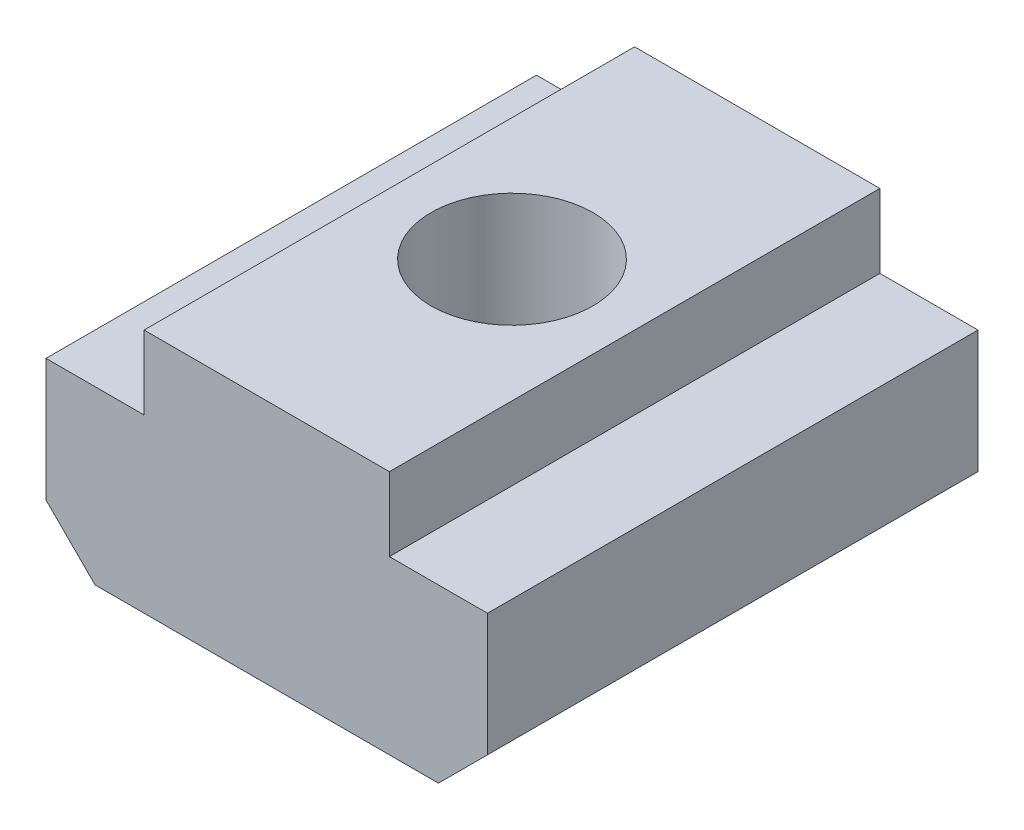
ISO-10303-21;
HEADER;
FILE_DESCRIPTION(('STEP AP214'),'2;1');
FILE_NAME('part.step','',(''),(''),'','','');
FILE_SCHEMA(('AUTOMOTIVE_DESIGN { 1 0 10303 214 1 1 1 1 }'));
ENDSEC;
DATA;
#1=APPLICATION_CONTEXT('core data for automotive mechanical design processes');
#2=APPLICATION_PROTOCOL_DEFINITION('international standard','automotive_design',2000,#1);
#3=PRODUCT_CONTEXT('',#1,'mechanical');
#4=PRODUCT('Part','Part','',(#3));
#5=PRODUCT_RELATED_PRODUCT_CATEGORY('part','',(#4));
#6=PRODUCT_DEFINITION_FORMATION('','',#4);
#7=PRODUCT_DEFINITION_CONTEXT('part definition',#1,'design');
#8=PRODUCT_DEFINITION('design','',#6,#7);
#9=PRODUCT_DEFINITION_SHAPE('','',#8);
#10=(LENGTH_UNIT() NAMED_UNIT(*) SI_UNIT(.MILLI.,.METRE.));
#11=(NAMED_UNIT(*) PLANE_ANGLE_UNIT() SI_UNIT($,.RADIAN.));
#12=(NAMED_UNIT(*) SI_UNIT($,.STERADIAN.) SOLID_ANGLE_UNIT());
#13=UNCERTAINTY_MEASURE_WITH_UNIT(LENGTH_MEASURE(1.E-05),#10,'distance_accuracy_value','');
#14=(GEOMETRIC_REPRESENTATION_CONTEXT(3) GLOBAL_UNCERTAINTY_ASSIGNED_CONTEXT((#13)) GLOBAL_UNIT_ASSIGNED_CONTEXT((#10,
#11,#12)) REPRESENTATION_CONTEXT('',''));
#15=CARTESIAN_POINT('',(0.,0.,0.));
#16=DIRECTION('',(0.,0.,1.));
#17=DIRECTION('',(1.,0.,0.));
#18=AXIS2_PLACEMENT_3D('',#15,#16,#17);
#19=CARTESIAN_POINT('',(-4.5,1.,10.));
#20=DIRECTION('',(0.707106781186547,0.707106781186548,0.));
#21=DIRECTION('',(-0.707106781186548,0.707106781186547,0.));
#22=AXIS2_PLACEMENT_3D('',#19,#20,#21);
#23=PLANE('',#22);
#24=DIRECTION('',(0.707106781186548,-0.707106781186547,0.));
#25=VECTOR('',#24,1.);
#26=CARTESIAN_POINT('',(-4.5,1.,0.));
#27=LINE('',#26,#25);
#28=CARTESIAN_POINT('',(-4.5,1.,0.));
#29=VERTEX_POINT('',#28);
#30=CARTESIAN_POINT('',(-3.5,0.,0.));
#31=VERTEX_POINT('',#30);
#32=EDGE_CURVE('E145',#29,#31,#27,.T.);
#33=ORIENTED_EDGE('',*,*,#32,.T.);
#34=DIRECTION('',(0.,0.,-1.));
#35=VECTOR('',#34,1.);
#36=CARTESIAN_POINT('',(-3.5,0.,10.));
#37=LINE('',#36,#35);
#38=CARTESIAN_POINT('',(-3.5,0.,10.));
#39=VERTEX_POINT('',#38);
#40=EDGE_CURVE('E11',#39,#31,#37,.T.);
#41=ORIENTED_EDGE('',*,*,#40,.F.);
#42=DIRECTION('',(0.707106781186548,-0.707106781186547,0.));
#43=VECTOR('',#42,1.);
#44=CARTESIAN_POINT('',(-4.5,1.,10.));
#45=LINE('',#44,#43);
#46=CARTESIAN_POINT('',(-4.5,1.,10.));
#47=VERTEX_POINT('',#46);
#48=EDGE_CURVE('E164',#47,#39,#45,.T.);
#49=ORIENTED_EDGE('',*,*,#48,.F.);
#50=DIRECTION('',(0.,0.,-1.));
#51=VECTOR('',#50,1.);
#52=CARTESIAN_POINT('',(-4.5,1.,10.));
#53=LINE('',#52,#51);
#54=EDGE_CURVE('E141',#47,#29,#53,.T.);
#55=ORIENTED_EDGE('',*,*,#54,.T.);
#56=EDGE_LOOP('',(#33,#41,#49,#55));
#57=FACE_BOUND('',#56,.T.);
#58=ADVANCED_FACE('F37',(#57),#23,.F.);
#59=CARTESIAN_POINT('',(-3.5,0.,10.));
#60=DIRECTION('',(0.,1.,0.));
#61=DIRECTION('',(0.,0.,1.));
#62=AXIS2_PLACEMENT_3D('',#59,#60,#61);
#63=PLANE('',#62);
#64=CARTESIAN_POINT('',(0.,0.,5.));
#65=DIRECTION('',(0.,1.,0.));
#66=DIRECTION('',(0.,0.,1.));
#67=AXIS2_PLACEMENT_3D('',#64,#65,#66);
#68=CIRCLE('',#67,1.65);
#69=CARTESIAN_POINT('',(0.,0.,6.65));
#70=VERTEX_POINT('',#69);
#71=EDGE_CURVE('E149',#70,#70,#68,.T.);
#72=ORIENTED_EDGE('',*,*,#71,.T.);
#73=EDGE_LOOP('',(#72));
#74=FACE_BOUND('',#73,.T.);
#75=DIRECTION('',(1.,0.,0.));
#76=VECTOR('',#75,1.);
#77=CARTESIAN_POINT('',(-3.5,0.,0.));
#78=LINE('',#77,#76);
#79=CARTESIAN_POINT('',(3.5,0.,0.));
#80=VERTEX_POINT('',#79);
#81=EDGE_CURVE('E148',#31,#80,#78,.T.);
#82=ORIENTED_EDGE('',*,*,#81,.T.);
#83=DIRECTION('',(0.,0.,-1.));
#84=VECTOR('',#83,1.);
#85=CARTESIAN_POINT('',(3.5,0.,10.));
#86=LINE('',#85,#84);
#87=CARTESIAN_POINT('',(3.5,0.,10.));
#88=VERTEX_POINT('',#87);
#89=EDGE_CURVE('E45',#88,#80,#86,.T.);
#90=ORIENTED_EDGE('',*,*,#89,.F.);
#91=DIRECTION('',(1.,0.,0.));
#92=VECTOR('',#91,1.);
#93=CARTESIAN_POINT('',(-3.5,0.,10.));
#94=LINE('',#93,#92);
#95=EDGE_CURVE('E102',#39,#88,#94,.T.);
#96=ORIENTED_EDGE('',*,*,#95,.F.);
#97=ORIENTED_EDGE('',*,*,#40,.T.);
#98=EDGE_LOOP('',(#82,#90,#96,#97));
#99=FACE_BOUND('',#98,.T.);
#100=ADVANCED_FACE('F240',(#74,#99),#63,.F.);
#101=CARTESIAN_POINT('',(3.5,0.,10.));
#102=DIRECTION('',(-0.707106781186547,0.707106781186548,0.));
#103=DIRECTION('',(-0.707106781186548,-0.707106781186547,0.));
#104=AXIS2_PLACEMENT_3D('',#101,#102,#103);
#105=PLANE('',#104);
#106=DIRECTION('',(0.707106781186548,0.707106781186547,0.));
#107=VECTOR('',#106,1.);
#108=CARTESIAN_POINT('',(3.5,0.,0.));
#109=LINE('',#108,#107);
#110=CARTESIAN_POINT('',(4.5,1.,0.));
#111=VERTEX_POINT('',#110);
#112=EDGE_CURVE('E151',#80,#111,#109,.T.);
#113=ORIENTED_EDGE('',*,*,#112,.T.);
#114=DIRECTION('',(0.,0.,-1.));
#115=VECTOR('',#114,1.);
#116=CARTESIAN_POINT('',(4.5,1.,10.));
#117=LINE('',#116,#115);
#118=CARTESIAN_POINT('',(4.5,1.,10.));
#119=VERTEX_POINT('',#118);
#120=EDGE_CURVE('E177',#119,#111,#117,.T.);
#121=ORIENTED_EDGE('',*,*,#120,.F.);
#122=DIRECTION('',(0.707106781186548,0.707106781186547,0.));
#123=VECTOR('',#122,1.);
#124=CARTESIAN_POINT('',(3.5,0.,10.));
#125=LINE('',#124,#123);
#126=EDGE_CURVE('E185',#88,#119,#125,.T.);
#127=ORIENTED_EDGE('',*,*,#126,.F.);
#128=ORIENTED_EDGE('',*,*,#89,.T.);
#129=EDGE_LOOP('',(#113,#121,#127,#128));
#130=FACE_BOUND('',#129,.T.);
#131=ADVANCED_FACE('F183',(#130),#105,.F.);
#132=CARTESIAN_POINT('',(4.5,1.,10.));
#133=DIRECTION('',(-1.,0.,0.));
#134=DIRECTION('',(0.,0.,1.));
#135=AXIS2_PLACEMENT_3D('',#132,#133,#134);
#136=PLANE('',#135);
#137=DIRECTION('',(0.,1.,0.));
#138=VECTOR('',#137,1.);
#139=CARTESIAN_POINT('',(4.5,1.,0.));
#140=LINE('',#139,#138);
#141=CARTESIAN_POINT('',(4.5,3.5,0.));
#142=VERTEX_POINT('',#141);
#143=EDGE_CURVE('E153',#111,#142,#140,.T.);
#144=ORIENTED_EDGE('',*,*,#143,.T.);
#145=DIRECTION('',(0.,0.,-1.));
#146=VECTOR('',#145,1.);
#147=CARTESIAN_POINT('',(4.5,3.5,10.));
#148=LINE('',#147,#146);
#149=CARTESIAN_POINT('',(4.5,3.5,10.));
#150=VERTEX_POINT('',#149);
#151=EDGE_CURVE('E174',#150,#142,#148,.T.);
#152=ORIENTED_EDGE('',*,*,#151,.F.);
#153=DIRECTION('',(0.,1.,0.));
#154=VECTOR('',#153,1.);
#155=CARTESIAN_POINT('',(4.5,1.,10.));
#156=LINE('',#155,#154);
#157=EDGE_CURVE('E203',#119,#150,#156,.T.);
#158=ORIENTED_EDGE('',*,*,#157,.F.);
#159=ORIENTED_EDGE('',*,*,#120,.T.);
#160=EDGE_LOOP('',(#144,#152,#158,#159));
#161=FACE_BOUND('',#160,.T.);
#162=ADVANCED_FACE('F194',(#161),#136,.F.);
#163=CARTESIAN_POINT('',(4.5,3.5,10.));
#164=DIRECTION('',(0.,-1.,0.));
#165=DIRECTION('',(1.,0.,0.));
#166=AXIS2_PLACEMENT_3D('',#163,#164,#165);
#167=PLANE('',#166);
#168=DIRECTION('',(-1.,0.,0.));
#169=VECTOR('',#168,1.);
#170=CARTESIAN_POINT('',(4.5,3.5,0.));
#171=LINE('',#170,#169);
#172=CARTESIAN_POINT('',(2.5,3.5,0.));
#173=VERTEX_POINT('',#172);
#174=EDGE_CURVE('E155',#142,#173,#171,.T.);
#175=ORIENTED_EDGE('',*,*,#174,.T.);
#176=DIRECTION('',(0.,0.,-1.));
#177=VECTOR('',#176,1.);
#178=CARTESIAN_POINT('',(2.5,3.5,10.));
#179=LINE('',#178,#177);
#180=CARTESIAN_POINT('',(2.5,3.5,10.));
#181=VERTEX_POINT('',#180);
#182=EDGE_CURVE('E171',#181,#173,#179,.T.);
#183=ORIENTED_EDGE('',*,*,#182,.F.);
#184=DIRECTION('',(-1.,0.,0.));
#185=VECTOR('',#184,1.);
#186=CARTESIAN_POINT('',(4.5,3.5,10.));
#187=LINE('',#186,#185);
#188=EDGE_CURVE('E200',#150,#181,#187,.T.);
#189=ORIENTED_EDGE('',*,*,#188,.F.);
#190=ORIENTED_EDGE('',*,*,#151,.T.);
#191=EDGE_LOOP('',(#175,#183,#189,#190));
#192=FACE_BOUND('',#191,.T.);
#193=ADVANCED_FACE('F198',(#192),#167,.F.);
#194=CARTESIAN_POINT('',(2.5,3.5,10.));
#195=DIRECTION('',(-1.,0.,0.));
#196=DIRECTION('',(0.,-1.,0.));
#197=AXIS2_PLACEMENT_3D('',#194,#195,#196);
#198=PLANE('',#197);
#199=DIRECTION('',(0.,1.,0.));
#200=VECTOR('',#199,1.);
#201=CARTESIAN_POINT('',(2.5,3.5,0.));
#202=LINE('',#201,#200);
#203=CARTESIAN_POINT('',(2.5,5.,0.));
#204=VERTEX_POINT('',#203);
#205=EDGE_CURVE('E157',#173,#204,#202,.T.);
#206=ORIENTED_EDGE('',*,*,#205,.T.);
#207=DIRECTION('',(0.,0.,-1.));
#208=VECTOR('',#207,1.);
#209=CARTESIAN_POINT('',(2.5,5.,10.));
#210=LINE('',#209,#208);
#211=CARTESIAN_POINT('',(2.5,5.,10.));
#212=VERTEX_POINT('',#211);
#213=EDGE_CURVE('E168',#212,#204,#210,.T.);
#214=ORIENTED_EDGE('',*,*,#213,.F.);
#215=DIRECTION('',(0.,1.,0.));
#216=VECTOR('',#215,1.);
#217=CARTESIAN_POINT('',(2.5,3.5,10.));
#218=LINE('',#217,#216);
#219=EDGE_CURVE('E202',#181,#212,#218,.T.);
#220=ORIENTED_EDGE('',*,*,#219,.F.);
#221=ORIENTED_EDGE('',*,*,#182,.T.);
#222=EDGE_LOOP('',(#206,#214,#220,#221));
#223=FACE_BOUND('',#222,.T.);
#224=ADVANCED_FACE('F222',(#223),#198,.F.);
#225=CARTESIAN_POINT('',(2.5,5.,10.));
#226=DIRECTION('',(0.,-1.,0.));
#227=DIRECTION('',(0.,0.,-1.));
#228=AXIS2_PLACEMENT_3D('',#225,#226,#227);
#229=PLANE('',#228);
#230=CARTESIAN_POINT('',(0.,5.,5.));
#231=DIRECTION('',(0.,1.,0.));
#232=DIRECTION('',(0.,0.,1.));
#233=AXIS2_PLACEMENT_3D('',#230,#231,#232);
#234=CIRCLE('',#233,1.65);
#235=CARTESIAN_POINT('',(0.,5.,6.65));
#236=VERTEX_POINT('',#235);
#237=EDGE_CURVE('E213',#236,#236,#234,.T.);
#238=ORIENTED_EDGE('',*,*,#237,.F.);
#239=EDGE_LOOP('',(#238));
#240=FACE_BOUND('',#239,.T.);
#241=DIRECTION('',(-1.,0.,0.));
#242=VECTOR('',#241,1.);
#243=CARTESIAN_POINT('',(2.5,5.,0.));
#244=LINE('',#243,#242);
#245=CARTESIAN_POINT('',(-2.5,5.,0.));
#246=VERTEX_POINT('',#245);
#247=EDGE_CURVE('E159',#204,#246,#244,.T.);
#248=ORIENTED_EDGE('',*,*,#247,.T.);
#249=DIRECTION('',(0.,0.,-1.));
#250=VECTOR('',#249,1.);
#251=CARTESIAN_POINT('',(-2.5,5.,10.));
#252=LINE('',#251,#250);
#253=CARTESIAN_POINT('',(-2.5,5.,10.));
#254=VERTEX_POINT('',#253);
#255=EDGE_CURVE('E136',#254,#246,#252,.T.);
#256=ORIENTED_EDGE('',*,*,#255,.F.);
#257=DIRECTION('',(-1.,0.,0.));
#258=VECTOR('',#257,1.);
#259=CARTESIAN_POINT('',(2.5,5.,10.));
#260=LINE('',#259,#258);
#261=EDGE_CURVE('E127',#212,#254,#260,.T.);
#262=ORIENTED_EDGE('',*,*,#261,.F.);
#263=ORIENTED_EDGE('',*,*,#213,.T.);
#264=EDGE_LOOP('',(#248,#256,#262,#263));
#265=FACE_BOUND('',#264,.T.);
#266=ADVANCED_FACE('F219',(#240,#265),#229,.F.);
#267=CARTESIAN_POINT('',(-2.5,5.,10.));
#268=DIRECTION('',(1.,0.,0.));
#269=DIRECTION('',(0.,1.,0.));
#270=AXIS2_PLACEMENT_3D('',#267,#268,#269);
#271=PLANE('',#270);
#272=DIRECTION('',(0.,-1.,0.));
#273=VECTOR('',#272,1.);
#274=CARTESIAN_POINT('',(-2.5,5.,0.));
#275=LINE('',#274,#273);
#276=CARTESIAN_POINT('',(-2.5,3.5,0.));
#277=VERTEX_POINT('',#276);
#278=EDGE_CURVE('E135',#246,#277,#275,.T.);
#279=ORIENTED_EDGE('',*,*,#278,.T.);
#280=DIRECTION('',(0.,0.,-1.));
#281=VECTOR('',#280,1.);
#282=CARTESIAN_POINT('',(-2.5,3.5,10.));
#283=LINE('',#282,#281);
#284=CARTESIAN_POINT('',(-2.5,3.5,10.));
#285=VERTEX_POINT('',#284);
#286=EDGE_CURVE('E132',#285,#277,#283,.T.);
#287=ORIENTED_EDGE('',*,*,#286,.F.);
#288=DIRECTION('',(0.,-1.,0.));
#289=VECTOR('',#288,1.);
#290=CARTESIAN_POINT('',(-2.5,5.,10.));
#291=LINE('',#290,#289);
#292=EDGE_CURVE('E121',#254,#285,#291,.T.);
#293=ORIENTED_EDGE('',*,*,#292,.F.);
#294=ORIENTED_EDGE('',*,*,#255,.T.);
#295=EDGE_LOOP('',(#279,#287,#293,#294));
#296=FACE_BOUND('',#295,.T.);
#297=ADVANCED_FACE('F133',(#296),#271,.F.);
#298=CARTESIAN_POINT('',(-2.5,3.5,10.));
#299=DIRECTION('',(0.,-1.,0.));
#300=DIRECTION('',(0.,0.,-1.));
#301=AXIS2_PLACEMENT_3D('',#298,#299,#300);
#302=PLANE('',#301);
#303=DIRECTION('',(-1.,0.,0.));
#304=VECTOR('',#303,1.);
#305=CARTESIAN_POINT('',(-2.5,3.5,0.));
#306=LINE('',#305,#304);
#307=CARTESIAN_POINT('',(-4.5,3.5,0.));
#308=VERTEX_POINT('',#307);
#309=EDGE_CURVE('E88',#277,#308,#306,.T.);
#310=ORIENTED_EDGE('',*,*,#309,.T.);
#311=DIRECTION('',(0.,0.,-1.));
#312=VECTOR('',#311,1.);
#313=CARTESIAN_POINT('',(-4.5,3.5,10.));
#314=LINE('',#313,#312);
#315=CARTESIAN_POINT('',(-4.5,3.5,10.));
#316=VERTEX_POINT('',#315);
#317=EDGE_CURVE('E137',#316,#308,#314,.T.);
#318=ORIENTED_EDGE('',*,*,#317,.F.);
#319=DIRECTION('',(-1.,0.,0.));
#320=VECTOR('',#319,1.);
#321=CARTESIAN_POINT('',(-2.5,3.5,10.));
#322=LINE('',#321,#320);
#323=EDGE_CURVE('E125',#285,#316,#322,.T.);
#324=ORIENTED_EDGE('',*,*,#323,.F.);
#325=ORIENTED_EDGE('',*,*,#286,.T.);
#326=EDGE_LOOP('',(#310,#318,#324,#325));
#327=FACE_BOUND('',#326,.T.);
#328=ADVANCED_FACE('F139',(#327),#302,.F.);
#329=CARTESIAN_POINT('',(-4.5,3.5,10.));
#330=DIRECTION('',(1.,0.,0.));
#331=DIRECTION('',(0.,0.,-1.));
#332=AXIS2_PLACEMENT_3D('',#329,#330,#331);
#333=PLANE('',#332);
#334=DIRECTION('',(0.,-1.,0.));
#335=VECTOR('',#334,1.);
#336=CARTESIAN_POINT('',(-4.5,3.5,0.));
#337=LINE('',#336,#335);
#338=EDGE_CURVE('E94',#308,#29,#337,.T.);
#339=ORIENTED_EDGE('',*,*,#338,.T.);
#340=ORIENTED_EDGE('',*,*,#54,.F.);
#341=DIRECTION('',(0.,-1.,0.));
#342=VECTOR('',#341,1.);
#343=CARTESIAN_POINT('',(-4.5,3.5,10.));
#344=LINE('',#343,#342);
#345=EDGE_CURVE('E53',#316,#47,#344,.T.);
#346=ORIENTED_EDGE('',*,*,#345,.F.);
#347=ORIENTED_EDGE('',*,*,#317,.T.);
#348=EDGE_LOOP('',(#339,#340,#346,#347));
#349=FACE_BOUND('',#348,.T.);
#350=ADVANCED_FACE('F229',(#349),#333,.F.);
#351=CARTESIAN_POINT('',(0.,0.,10.));
#352=DIRECTION('',(0.,0.,1.));
#353=DIRECTION('',(1.,0.,0.));
#354=AXIS2_PLACEMENT_3D('',#351,#352,#353);
#355=PLANE('',#354);
#356=ORIENTED_EDGE('',*,*,#48,.T.);
#357=ORIENTED_EDGE('',*,*,#95,.T.);
#358=ORIENTED_EDGE('',*,*,#126,.T.);
#359=ORIENTED_EDGE('',*,*,#157,.T.);
#360=ORIENTED_EDGE('',*,*,#188,.T.);
#361=ORIENTED_EDGE('',*,*,#219,.T.);
#362=ORIENTED_EDGE('',*,*,#261,.T.);
#363=ORIENTED_EDGE('',*,*,#292,.T.);
#364=ORIENTED_EDGE('',*,*,#323,.T.);
#365=ORIENTED_EDGE('',*,*,#345,.T.);
#366=EDGE_LOOP('',(#356,#357,#358,#359,#360,#361,#362,#363,#364,#365));
#367=FACE_BOUND('',#366,.T.);
#368=ADVANCED_FACE('F123',(#367),#355,.T.);
#369=CARTESIAN_POINT('',(0.,0.,0.));
#370=DIRECTION('',(0.,0.,1.));
#371=DIRECTION('',(1.,0.,0.));
#372=AXIS2_PLACEMENT_3D('',#369,#370,#371);
#373=PLANE('',#372);
#374=ORIENTED_EDGE('',*,*,#32,.F.);
#375=ORIENTED_EDGE('',*,*,#338,.F.);
#376=ORIENTED_EDGE('',*,*,#309,.F.);
#377=ORIENTED_EDGE('',*,*,#278,.F.);
#378=ORIENTED_EDGE('',*,*,#247,.F.);
#379=ORIENTED_EDGE('',*,*,#205,.F.);
#380=ORIENTED_EDGE('',*,*,#174,.F.);
#381=ORIENTED_EDGE('',*,*,#143,.F.);
#382=ORIENTED_EDGE('',*,*,#112,.F.);
#383=ORIENTED_EDGE('',*,*,#81,.F.);
#384=EDGE_LOOP('',(#374,#375,#376,#377,#378,#379,#380,#381,#382,#383));
#385=FACE_BOUND('',#384,.T.);
#386=ADVANCED_FACE('F189',(#385),#373,.F.);
#387=CARTESIAN_POINT('',(0.,5.,5.));
#388=DIRECTION('',(0.,1.,0.));
#389=DIRECTION('',(0.,0.,1.));
#390=AXIS2_PLACEMENT_3D('',#387,#388,#389);
#391=CYLINDRICAL_SURFACE('',#390,1.65);
#392=ORIENTED_EDGE('',*,*,#71,.F.);
#393=EDGE_LOOP('',(#392));
#394=FACE_BOUND('',#393,.T.);
#395=ORIENTED_EDGE('',*,*,#237,.T.);
#396=EDGE_LOOP('',(#395));
#397=FACE_BOUND('',#396,.T.);
#398=ADVANCED_FACE('F217',(#394,#397),#391,.F.);
#399=CLOSED_SHELL('',(#58,#100,#131,#162,#193,#224,#266,#297,#328,#350,#368,#386,#398));
#400=MANIFOLD_SOLID_BREP('B2',#399);
#401=ADVANCED_BREP_SHAPE_REPRESENTATION('',(#18,#400),#14);
#402=SHAPE_DEFINITION_REPRESENTATION(#9,#401);
ENDSEC;
END-ISO-10303-21;
